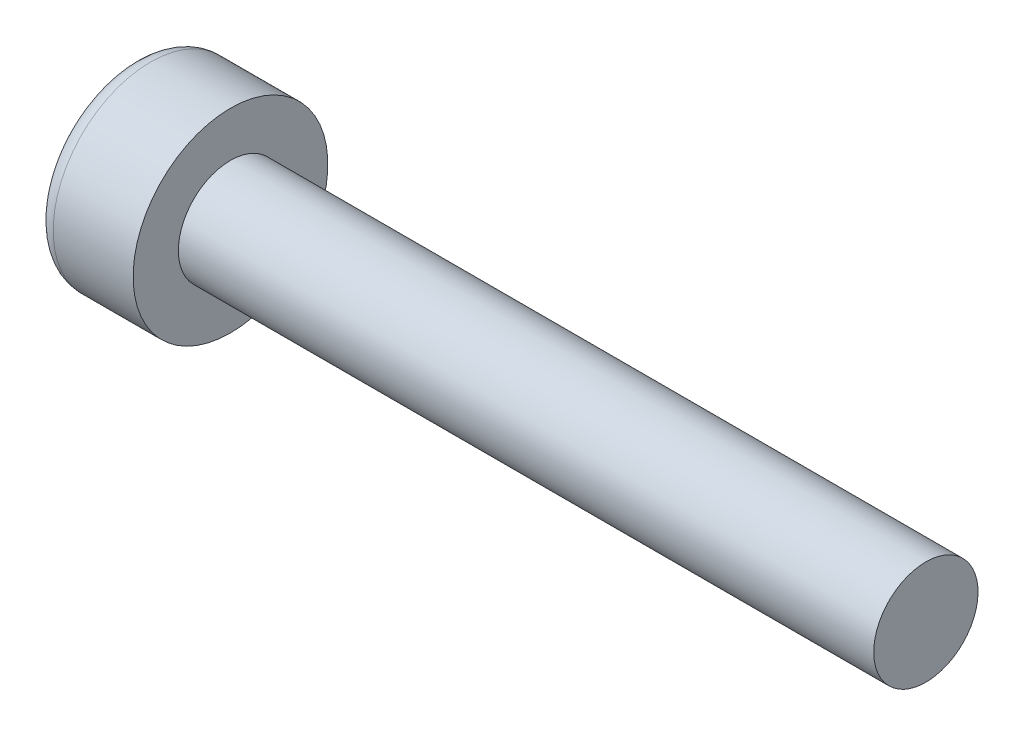
ISO-10303-21;
HEADER;
FILE_DESCRIPTION(('STEP AP214'),'2;1');
FILE_NAME('part.step','',(''),(''),'','','');
FILE_SCHEMA(('AUTOMOTIVE_DESIGN { 1 0 10303 214 1 1 1 1 }'));
ENDSEC;
DATA;
#1=APPLICATION_CONTEXT('core data for automotive mechanical design processes');
#2=APPLICATION_PROTOCOL_DEFINITION('international standard','automotive_design',2000,#1);
#3=PRODUCT_CONTEXT('',#1,'mechanical');
#4=PRODUCT('Part','Part','',(#3));
#5=PRODUCT_RELATED_PRODUCT_CATEGORY('part','',(#4));
#6=PRODUCT_DEFINITION_FORMATION('','',#4);
#7=PRODUCT_DEFINITION_CONTEXT('part definition',#1,'design');
#8=PRODUCT_DEFINITION('design','',#6,#7);
#9=PRODUCT_DEFINITION_SHAPE('','',#8);
#10=(LENGTH_UNIT() NAMED_UNIT(*) SI_UNIT(.MILLI.,.METRE.));
#11=(NAMED_UNIT(*) PLANE_ANGLE_UNIT() SI_UNIT($,.RADIAN.));
#12=(NAMED_UNIT(*) SI_UNIT($,.STERADIAN.) SOLID_ANGLE_UNIT());
#13=UNCERTAINTY_MEASURE_WITH_UNIT(LENGTH_MEASURE(1.E-05),#10,'distance_accuracy_value','');
#14=(GEOMETRIC_REPRESENTATION_CONTEXT(3) GLOBAL_UNCERTAINTY_ASSIGNED_CONTEXT((#13)) GLOBAL_UNIT_ASSIGNED_CONTEXT((#10,
#11,#12)) REPRESENTATION_CONTEXT('',''));
#15=CARTESIAN_POINT('',(0.,0.,0.));
#16=DIRECTION('',(0.,0.,1.));
#17=DIRECTION('',(1.,0.,0.));
#18=AXIS2_PLACEMENT_3D('',#15,#16,#17);
#19=CARTESIAN_POINT('',(0.,1.3,0.));
#20=DIRECTION('',(1.,0.,0.));
#21=DIRECTION('',(0.,1.,0.));
#22=AXIS2_PLACEMENT_3D('',#19,#20,#21);
#23=PLANE('',#22);
#24=CARTESIAN_POINT('',(0.,-1.5,0.));
#25=DIRECTION('',(1.,0.,0.));
#26=DIRECTION('',(0.,1.,0.));
#27=AXIS2_PLACEMENT_3D('',#24,#25,#26);
#28=CIRCLE('',#27,2.8);
#29=CARTESIAN_POINT('',(0.,1.3,0.));
#30=VERTEX_POINT('',#29);
#31=EDGE_CURVE('E66',#30,#30,#28,.T.);
#32=ORIENTED_EDGE('',*,*,#31,.T.);
#33=EDGE_LOOP('',(#32));
#34=FACE_BOUND('',#33,.T.);
#35=CARTESIAN_POINT('',(0.,-1.5,0.));
#36=DIRECTION('',(1.,0.,0.));
#37=DIRECTION('',(0.,1.,0.));
#38=AXIS2_PLACEMENT_3D('',#35,#36,#37);
#39=CIRCLE('',#38,1.5);
#40=CARTESIAN_POINT('',(0.,0.,0.));
#41=VERTEX_POINT('',#40);
#42=EDGE_CURVE('E10',#41,#41,#39,.T.);
#43=ORIENTED_EDGE('',*,*,#42,.F.);
#44=EDGE_LOOP('',(#43));
#45=FACE_BOUND('',#44,.T.);
#46=ADVANCED_FACE('F43',(#34,#45),#23,.T.);
#47=CARTESIAN_POINT('',(20.,-1.5,0.));
#48=DIRECTION('',(1.,0.,0.));
#49=DIRECTION('',(0.,1.,0.));
#50=AXIS2_PLACEMENT_3D('',#47,#48,#49);
#51=CYLINDRICAL_SURFACE('',#50,1.5);
#52=ORIENTED_EDGE('',*,*,#42,.T.);
#53=EDGE_LOOP('',(#52));
#54=FACE_BOUND('',#53,.T.);
#55=CARTESIAN_POINT('',(20.,-1.5,0.));
#56=DIRECTION('',(1.,0.,0.));
#57=DIRECTION('',(0.,1.,0.));
#58=AXIS2_PLACEMENT_3D('',#55,#56,#57);
#59=CIRCLE('',#58,1.5);
#60=CARTESIAN_POINT('',(20.,0.,0.));
#61=VERTEX_POINT('',#60);
#62=EDGE_CURVE('E50',#61,#61,#59,.T.);
#63=ORIENTED_EDGE('',*,*,#62,.F.);
#64=EDGE_LOOP('',(#63));
#65=FACE_BOUND('',#64,.T.);
#66=ADVANCED_FACE('F85',(#54,#65),#51,.T.);
#67=CARTESIAN_POINT('',(20.,0.,0.));
#68=DIRECTION('',(1.,0.,0.));
#69=DIRECTION('',(0.,1.,0.));
#70=AXIS2_PLACEMENT_3D('',#67,#68,#69);
#71=PLANE('',#70);
#72=ORIENTED_EDGE('',*,*,#62,.T.);
#73=EDGE_LOOP('',(#72));
#74=FACE_BOUND('',#73,.T.);
#75=ADVANCED_FACE('F89',(#74),#71,.T.);
#76=CARTESIAN_POINT('',(-2.8,-1.5,0.));
#77=DIRECTION('',(-1.,0.,0.));
#78=DIRECTION('',(0.,-1.,0.));
#79=AXIS2_PLACEMENT_3D('',#76,#77,#78);
#80=PLANE('',#79);
#81=CARTESIAN_POINT('',(-2.8,-1.5,0.));
#82=DIRECTION('',(1.,0.,0.));
#83=DIRECTION('',(0.,1.,0.));
#84=AXIS2_PLACEMENT_3D('',#81,#82,#83);
#85=CIRCLE('',#84,2.3);
#86=CARTESIAN_POINT('',(-2.8,0.799999999999997,0.));
#87=VERTEX_POINT('',#86);
#88=EDGE_CURVE('E55',#87,#87,#85,.T.);
#89=ORIENTED_EDGE('',*,*,#88,.F.);
#90=EDGE_LOOP('',(#89));
#91=FACE_BOUND('',#90,.T.);
#92=ADVANCED_FACE('F81',(#91),#80,.T.);
#93=CARTESIAN_POINT('',(-2.3,-1.5,0.));
#94=DIRECTION('',(1.,0.,0.));
#95=DIRECTION('',(0.,1.,0.));
#96=AXIS2_PLACEMENT_3D('',#93,#94,#95);
#97=TOROIDAL_SURFACE('',#96,2.3,0.5);
#98=ORIENTED_EDGE('',*,*,#88,.T.);
#99=EDGE_LOOP('',(#98));
#100=FACE_BOUND('',#99,.T.);
#101=CARTESIAN_POINT('',(-2.3,-1.5,0.));
#102=DIRECTION('',(1.,0.,0.));
#103=DIRECTION('',(0.,1.,0.));
#104=AXIS2_PLACEMENT_3D('',#101,#102,#103);
#105=CIRCLE('',#104,2.8);
#106=CARTESIAN_POINT('',(-2.3,1.3,0.));
#107=VERTEX_POINT('',#106);
#108=EDGE_CURVE('E60',#107,#107,#105,.T.);
#109=ORIENTED_EDGE('',*,*,#108,.F.);
#110=EDGE_LOOP('',(#109));
#111=FACE_BOUND('',#110,.T.);
#112=ADVANCED_FACE('F75',(#100,#111),#97,.T.);
#113=CARTESIAN_POINT('',(20.,-1.5,0.));
#114=DIRECTION('',(1.,0.,0.));
#115=DIRECTION('',(0.,1.,0.));
#116=AXIS2_PLACEMENT_3D('',#113,#114,#115);
#117=CYLINDRICAL_SURFACE('',#116,2.8);
#118=ORIENTED_EDGE('',*,*,#108,.T.);
#119=EDGE_LOOP('',(#118));
#120=FACE_BOUND('',#119,.T.);
#121=ORIENTED_EDGE('',*,*,#31,.F.);
#122=EDGE_LOOP('',(#121));
#123=FACE_BOUND('',#122,.T.);
#124=ADVANCED_FACE('F73',(#120,#123),#117,.T.);
#125=CLOSED_SHELL('',(#46,#66,#75,#92,#112,#124));
#126=MANIFOLD_SOLID_BREP('B2',#125);
#127=ADVANCED_BREP_SHAPE_REPRESENTATION('',(#18,#126),#14);
#128=SHAPE_DEFINITION_REPRESENTATION(#9,#127);
ENDSEC;
END-ISO-10303-21;
